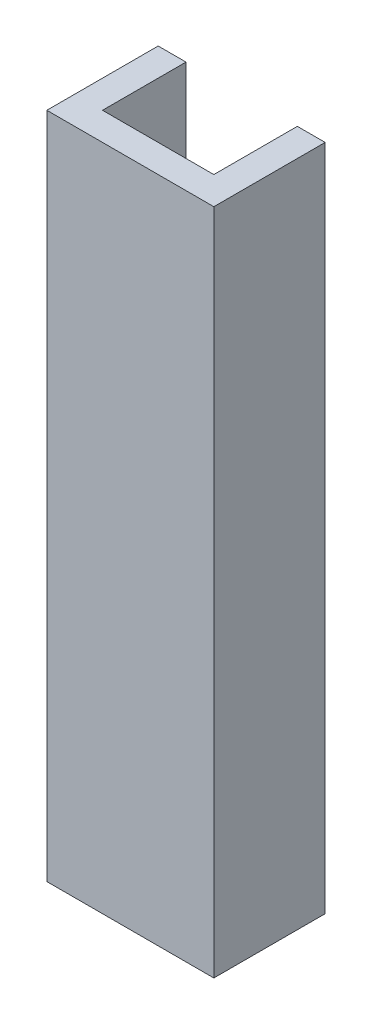
ISO-10303-21;
HEADER;
FILE_DESCRIPTION(('STEP AP214'),'2;1');
FILE_NAME('part.step','',(''),(''),'','','');
FILE_SCHEMA(('AUTOMOTIVE_DESIGN { 1 0 10303 214 1 1 1 1 }'));
ENDSEC;
DATA;
#1=APPLICATION_CONTEXT('core data for automotive mechanical design processes');
#2=APPLICATION_PROTOCOL_DEFINITION('international standard','automotive_design',2000,#1);
#3=PRODUCT_CONTEXT('',#1,'mechanical');
#4=PRODUCT('Part','Part','',(#3));
#5=PRODUCT_RELATED_PRODUCT_CATEGORY('part','',(#4));
#6=PRODUCT_DEFINITION_FORMATION('','',#4);
#7=PRODUCT_DEFINITION_CONTEXT('part definition',#1,'design');
#8=PRODUCT_DEFINITION('design','',#6,#7);
#9=PRODUCT_DEFINITION_SHAPE('','',#8);
#10=(LENGTH_UNIT() NAMED_UNIT(*) SI_UNIT(.MILLI.,.METRE.));
#11=(NAMED_UNIT(*) PLANE_ANGLE_UNIT() SI_UNIT($,.RADIAN.));
#12=(NAMED_UNIT(*) SI_UNIT($,.STERADIAN.) SOLID_ANGLE_UNIT());
#13=UNCERTAINTY_MEASURE_WITH_UNIT(LENGTH_MEASURE(1.E-05),#10,'distance_accuracy_value','');
#14=(GEOMETRIC_REPRESENTATION_CONTEXT(3) GLOBAL_UNCERTAINTY_ASSIGNED_CONTEXT((#13)) GLOBAL_UNIT_ASSIGNED_CONTEXT((#10,
#11,#12)) REPRESENTATION_CONTEXT('',''));
#15=CARTESIAN_POINT('',(0.,0.,0.));
#16=DIRECTION('',(0.,0.,1.));
#17=DIRECTION('',(1.,0.,0.));
#18=AXIS2_PLACEMENT_3D('',#15,#16,#17);
#19=CARTESIAN_POINT('',(-50.8,609.6,0.));
#20=DIRECTION('',(-1.,0.,0.));
#21=DIRECTION('',(0.,0.,1.));
#22=AXIS2_PLACEMENT_3D('',#19,#20,#21);
#23=PLANE('',#22);
#24=DIRECTION('',(0.,0.,-1.));
#25=VECTOR('',#24,1.);
#26=CARTESIAN_POINT('',(-50.8,0.,0.));
#27=LINE('',#26,#25);
#28=CARTESIAN_POINT('',(-50.8,0.,0.));
#29=VERTEX_POINT('',#28);
#30=CARTESIAN_POINT('',(-50.8,0.,-76.2));
#31=VERTEX_POINT('',#30);
#32=EDGE_CURVE('E126',#29,#31,#27,.T.);
#33=ORIENTED_EDGE('',*,*,#32,.T.);
#34=DIRECTION('',(0.,-1.,0.));
#35=VECTOR('',#34,1.);
#36=CARTESIAN_POINT('',(-50.8,609.6,-76.2));
#37=LINE('',#36,#35);
#38=CARTESIAN_POINT('',(-50.8,609.6,-76.2));
#39=VERTEX_POINT('',#38);
#40=EDGE_CURVE('E11',#39,#31,#37,.T.);
#41=ORIENTED_EDGE('',*,*,#40,.F.);
#42=DIRECTION('',(0.,0.,-1.));
#43=VECTOR('',#42,1.);
#44=CARTESIAN_POINT('',(-50.8,609.6,0.));
#45=LINE('',#44,#43);
#46=CARTESIAN_POINT('',(-50.8,609.6,0.));
#47=VERTEX_POINT('',#46);
#48=EDGE_CURVE('E140',#47,#39,#45,.T.);
#49=ORIENTED_EDGE('',*,*,#48,.F.);
#50=DIRECTION('',(0.,-1.,0.));
#51=VECTOR('',#50,1.);
#52=CARTESIAN_POINT('',(-50.8,609.6,0.));
#53=LINE('',#52,#51);
#54=EDGE_CURVE('E122',#47,#29,#53,.T.);
#55=ORIENTED_EDGE('',*,*,#54,.T.);
#56=EDGE_LOOP('',(#33,#41,#49,#55));
#57=FACE_BOUND('',#56,.T.);
#58=ADVANCED_FACE('F30',(#57),#23,.F.);
#59=CARTESIAN_POINT('',(-50.8,609.6,-76.2));
#60=DIRECTION('',(0.,0.,1.));
#61=DIRECTION('',(1.,0.,0.));
#62=AXIS2_PLACEMENT_3D('',#59,#60,#61);
#63=PLANE('',#62);
#64=DIRECTION('',(-1.,0.,0.));
#65=VECTOR('',#64,1.);
#66=CARTESIAN_POINT('',(-50.8,0.,-76.2));
#67=LINE('',#66,#65);
#68=CARTESIAN_POINT('',(-76.2,0.,-76.2));
#69=VERTEX_POINT('',#68);
#70=EDGE_CURVE('E129',#31,#69,#67,.T.);
#71=ORIENTED_EDGE('',*,*,#70,.T.);
#72=DIRECTION('',(0.,-1.,0.));
#73=VECTOR('',#72,1.);
#74=CARTESIAN_POINT('',(-76.2,609.6,-76.2));
#75=LINE('',#74,#73);
#76=CARTESIAN_POINT('',(-76.2,609.6,-76.2));
#77=VERTEX_POINT('',#76);
#78=EDGE_CURVE('E38',#77,#69,#75,.T.);
#79=ORIENTED_EDGE('',*,*,#78,.F.);
#80=DIRECTION('',(-1.,0.,0.));
#81=VECTOR('',#80,1.);
#82=CARTESIAN_POINT('',(-50.8,609.6,-76.2));
#83=LINE('',#82,#81);
#84=EDGE_CURVE('E89',#39,#77,#83,.T.);
#85=ORIENTED_EDGE('',*,*,#84,.F.);
#86=ORIENTED_EDGE('',*,*,#40,.T.);
#87=EDGE_LOOP('',(#71,#79,#85,#86));
#88=FACE_BOUND('',#87,.T.);
#89=ADVANCED_FACE('F175',(#88),#63,.F.);
#90=CARTESIAN_POINT('',(-76.2,609.6,-76.2));
#91=DIRECTION('',(1.,0.,0.));
#92=DIRECTION('',(0.,0.,-1.));
#93=AXIS2_PLACEMENT_3D('',#90,#91,#92);
#94=PLANE('',#93);
#95=DIRECTION('',(0.,0.,1.));
#96=VECTOR('',#95,1.);
#97=CARTESIAN_POINT('',(-76.2,0.,-76.2));
#98=LINE('',#97,#96);
#99=CARTESIAN_POINT('',(-76.2,0.,25.4));
#100=VERTEX_POINT('',#99);
#101=EDGE_CURVE('E131',#69,#100,#98,.T.);
#102=ORIENTED_EDGE('',*,*,#101,.T.);
#103=DIRECTION('',(0.,-1.,0.));
#104=VECTOR('',#103,1.);
#105=CARTESIAN_POINT('',(-76.2,609.6,25.4));
#106=LINE('',#105,#104);
#107=CARTESIAN_POINT('',(-76.2,609.6,25.4));
#108=VERTEX_POINT('',#107);
#109=EDGE_CURVE('E147',#108,#100,#106,.T.);
#110=ORIENTED_EDGE('',*,*,#109,.F.);
#111=DIRECTION('',(0.,0.,1.));
#112=VECTOR('',#111,1.);
#113=CARTESIAN_POINT('',(-76.2,609.6,-76.2));
#114=LINE('',#113,#112);
#115=EDGE_CURVE('E155',#77,#108,#114,.T.);
#116=ORIENTED_EDGE('',*,*,#115,.F.);
#117=ORIENTED_EDGE('',*,*,#78,.T.);
#118=EDGE_LOOP('',(#102,#110,#116,#117));
#119=FACE_BOUND('',#118,.T.);
#120=ADVANCED_FACE('F153',(#119),#94,.F.);
#121=CARTESIAN_POINT('',(-76.2,609.6,25.4));
#122=DIRECTION('',(0.,0.,-1.));
#123=DIRECTION('',(-1.,0.,0.));
#124=AXIS2_PLACEMENT_3D('',#121,#122,#123);
#125=PLANE('',#124);
#126=DIRECTION('',(1.,0.,0.));
#127=VECTOR('',#126,1.);
#128=CARTESIAN_POINT('',(-76.2,0.,25.4));
#129=LINE('',#128,#127);
#130=CARTESIAN_POINT('',(76.2,0.,25.4));
#131=VERTEX_POINT('',#130);
#132=EDGE_CURVE('E133',#100,#131,#129,.T.);
#133=ORIENTED_EDGE('',*,*,#132,.T.);
#134=DIRECTION('',(0.,-1.,0.));
#135=VECTOR('',#134,1.);
#136=CARTESIAN_POINT('',(76.2,609.6,25.4));
#137=LINE('',#136,#135);
#138=CARTESIAN_POINT('',(76.2,609.6,25.4));
#139=VERTEX_POINT('',#138);
#140=EDGE_CURVE('E144',#139,#131,#137,.T.);
#141=ORIENTED_EDGE('',*,*,#140,.F.);
#142=DIRECTION('',(1.,0.,0.));
#143=VECTOR('',#142,1.);
#144=CARTESIAN_POINT('',(-76.2,609.6,25.4));
#145=LINE('',#144,#143);
#146=EDGE_CURVE('E167',#108,#139,#145,.T.);
#147=ORIENTED_EDGE('',*,*,#146,.F.);
#148=ORIENTED_EDGE('',*,*,#109,.T.);
#149=EDGE_LOOP('',(#133,#141,#147,#148));
#150=FACE_BOUND('',#149,.T.);
#151=ADVANCED_FACE('F163',(#150),#125,.F.);
#152=CARTESIAN_POINT('',(76.2,609.6,-76.2));
#153=DIRECTION('',(-1.,0.,0.));
#154=DIRECTION('',(0.,0.,1.));
#155=AXIS2_PLACEMENT_3D('',#152,#153,#154);
#156=PLANE('',#155);
#157=DIRECTION('',(0.,0.,-1.));
#158=VECTOR('',#157,1.);
#159=CARTESIAN_POINT('',(76.2,0.,-76.2));
#160=LINE('',#159,#158);
#161=CARTESIAN_POINT('',(76.2,0.,-76.2));
#162=VERTEX_POINT('',#161);
#163=EDGE_CURVE('E135',#131,#162,#160,.T.);
#164=ORIENTED_EDGE('',*,*,#163,.T.);
#165=DIRECTION('',(0.,-1.,0.));
#166=VECTOR('',#165,1.);
#167=CARTESIAN_POINT('',(76.2,609.6,-76.2));
#168=LINE('',#167,#166);
#169=CARTESIAN_POINT('',(76.2,609.6,-76.2));
#170=VERTEX_POINT('',#169);
#171=EDGE_CURVE('E117',#170,#162,#168,.T.);
#172=ORIENTED_EDGE('',*,*,#171,.F.);
#173=DIRECTION('',(0.,0.,-1.));
#174=VECTOR('',#173,1.);
#175=CARTESIAN_POINT('',(76.2,609.6,-76.2));
#176=LINE('',#175,#174);
#177=EDGE_CURVE('E108',#139,#170,#176,.T.);
#178=ORIENTED_EDGE('',*,*,#177,.F.);
#179=ORIENTED_EDGE('',*,*,#140,.T.);
#180=EDGE_LOOP('',(#164,#172,#178,#179));
#181=FACE_BOUND('',#180,.T.);
#182=ADVANCED_FACE('F166',(#181),#156,.F.);
#183=CARTESIAN_POINT('',(50.8,609.6,-76.2));
#184=DIRECTION('',(0.,0.,1.));
#185=DIRECTION('',(1.,0.,0.));
#186=AXIS2_PLACEMENT_3D('',#183,#184,#185);
#187=PLANE('',#186);
#188=DIRECTION('',(-1.,0.,0.));
#189=VECTOR('',#188,1.);
#190=CARTESIAN_POINT('',(50.8,0.,-76.2));
#191=LINE('',#190,#189);
#192=CARTESIAN_POINT('',(50.8,0.,-76.2));
#193=VERTEX_POINT('',#192);
#194=EDGE_CURVE('E116',#162,#193,#191,.T.);
#195=ORIENTED_EDGE('',*,*,#194,.T.);
#196=DIRECTION('',(0.,-1.,0.));
#197=VECTOR('',#196,1.);
#198=CARTESIAN_POINT('',(50.8,609.6,-76.2));
#199=LINE('',#198,#197);
#200=CARTESIAN_POINT('',(50.8,609.6,-76.2));
#201=VERTEX_POINT('',#200);
#202=EDGE_CURVE('E113',#201,#193,#199,.T.);
#203=ORIENTED_EDGE('',*,*,#202,.F.);
#204=DIRECTION('',(-1.,0.,0.));
#205=VECTOR('',#204,1.);
#206=CARTESIAN_POINT('',(50.8,609.6,-76.2));
#207=LINE('',#206,#205);
#208=EDGE_CURVE('E102',#170,#201,#207,.T.);
#209=ORIENTED_EDGE('',*,*,#208,.F.);
#210=ORIENTED_EDGE('',*,*,#171,.T.);
#211=EDGE_LOOP('',(#195,#203,#209,#210));
#212=FACE_BOUND('',#211,.T.);
#213=ADVANCED_FACE('F114',(#212),#187,.F.);
#214=CARTESIAN_POINT('',(50.8,609.6,0.));
#215=DIRECTION('',(1.,0.,0.));
#216=DIRECTION('',(0.,0.,-1.));
#217=AXIS2_PLACEMENT_3D('',#214,#215,#216);
#218=PLANE('',#217);
#219=DIRECTION('',(0.,0.,1.));
#220=VECTOR('',#219,1.);
#221=CARTESIAN_POINT('',(50.8,0.,0.));
#222=LINE('',#221,#220);
#223=CARTESIAN_POINT('',(50.8,0.,0.));
#224=VERTEX_POINT('',#223);
#225=EDGE_CURVE('E75',#193,#224,#222,.T.);
#226=ORIENTED_EDGE('',*,*,#225,.T.);
#227=DIRECTION('',(0.,-1.,0.));
#228=VECTOR('',#227,1.);
#229=CARTESIAN_POINT('',(50.8,609.6,0.));
#230=LINE('',#229,#228);
#231=CARTESIAN_POINT('',(50.8,609.6,0.));
#232=VERTEX_POINT('',#231);
#233=EDGE_CURVE('E118',#232,#224,#230,.T.);
#234=ORIENTED_EDGE('',*,*,#233,.F.);
#235=DIRECTION('',(0.,0.,1.));
#236=VECTOR('',#235,1.);
#237=CARTESIAN_POINT('',(50.8,609.6,0.));
#238=LINE('',#237,#236);
#239=EDGE_CURVE('E106',#201,#232,#238,.T.);
#240=ORIENTED_EDGE('',*,*,#239,.F.);
#241=ORIENTED_EDGE('',*,*,#202,.T.);
#242=EDGE_LOOP('',(#226,#234,#240,#241));
#243=FACE_BOUND('',#242,.T.);
#244=ADVANCED_FACE('F120',(#243),#218,.F.);
#245=CARTESIAN_POINT('',(50.8,609.6,0.));
#246=DIRECTION('',(0.,0.,1.));
#247=DIRECTION('',(1.,0.,0.));
#248=AXIS2_PLACEMENT_3D('',#245,#246,#247);
#249=PLANE('',#248);
#250=DIRECTION('',(-1.,0.,0.));
#251=VECTOR('',#250,1.);
#252=CARTESIAN_POINT('',(50.8,0.,0.));
#253=LINE('',#252,#251);
#254=EDGE_CURVE('E81',#224,#29,#253,.T.);
#255=ORIENTED_EDGE('',*,*,#254,.T.);
#256=ORIENTED_EDGE('',*,*,#54,.F.);
#257=DIRECTION('',(-1.,0.,0.));
#258=VECTOR('',#257,1.);
#259=CARTESIAN_POINT('',(50.8,609.6,0.));
#260=LINE('',#259,#258);
#261=EDGE_CURVE('E46',#232,#47,#260,.T.);
#262=ORIENTED_EDGE('',*,*,#261,.F.);
#263=ORIENTED_EDGE('',*,*,#233,.T.);
#264=EDGE_LOOP('',(#255,#256,#262,#263));
#265=FACE_BOUND('',#264,.T.);
#266=ADVANCED_FACE('F191',(#265),#249,.F.);
#267=CARTESIAN_POINT('',(-50.8,609.6,-76.2));
#268=DIRECTION('',(0.,1.,0.));
#269=DIRECTION('',(0.,0.,1.));
#270=AXIS2_PLACEMENT_3D('',#267,#268,#269);
#271=PLANE('',#270);
#272=ORIENTED_EDGE('',*,*,#48,.T.);
#273=ORIENTED_EDGE('',*,*,#84,.T.);
#274=ORIENTED_EDGE('',*,*,#115,.T.);
#275=ORIENTED_EDGE('',*,*,#146,.T.);
#276=ORIENTED_EDGE('',*,*,#177,.T.);
#277=ORIENTED_EDGE('',*,*,#208,.T.);
#278=ORIENTED_EDGE('',*,*,#239,.T.);
#279=ORIENTED_EDGE('',*,*,#261,.T.);
#280=EDGE_LOOP('',(#272,#273,#274,#275,#276,#277,#278,#279));
#281=FACE_BOUND('',#280,.T.);
#282=ADVANCED_FACE('F104',(#281),#271,.T.);
#283=CARTESIAN_POINT('',(-50.8,0.,-76.2));
#284=DIRECTION('',(0.,1.,0.));
#285=DIRECTION('',(0.,0.,1.));
#286=AXIS2_PLACEMENT_3D('',#283,#284,#285);
#287=PLANE('',#286);
#288=ORIENTED_EDGE('',*,*,#32,.F.);
#289=ORIENTED_EDGE('',*,*,#254,.F.);
#290=ORIENTED_EDGE('',*,*,#225,.F.);
#291=ORIENTED_EDGE('',*,*,#194,.F.);
#292=ORIENTED_EDGE('',*,*,#163,.F.);
#293=ORIENTED_EDGE('',*,*,#132,.F.);
#294=ORIENTED_EDGE('',*,*,#101,.F.);
#295=ORIENTED_EDGE('',*,*,#70,.F.);
#296=EDGE_LOOP('',(#288,#289,#290,#291,#292,#293,#294,#295));
#297=FACE_BOUND('',#296,.T.);
#298=ADVANCED_FACE('F159',(#297),#287,.F.);
#299=CLOSED_SHELL('',(#58,#89,#120,#151,#182,#213,#244,#266,#282,#298));
#300=MANIFOLD_SOLID_BREP('B2',#299);
#301=ADVANCED_BREP_SHAPE_REPRESENTATION('',(#18,#300),#14);
#302=SHAPE_DEFINITION_REPRESENTATION(#9,#301);
ENDSEC;
END-ISO-10303-21;
